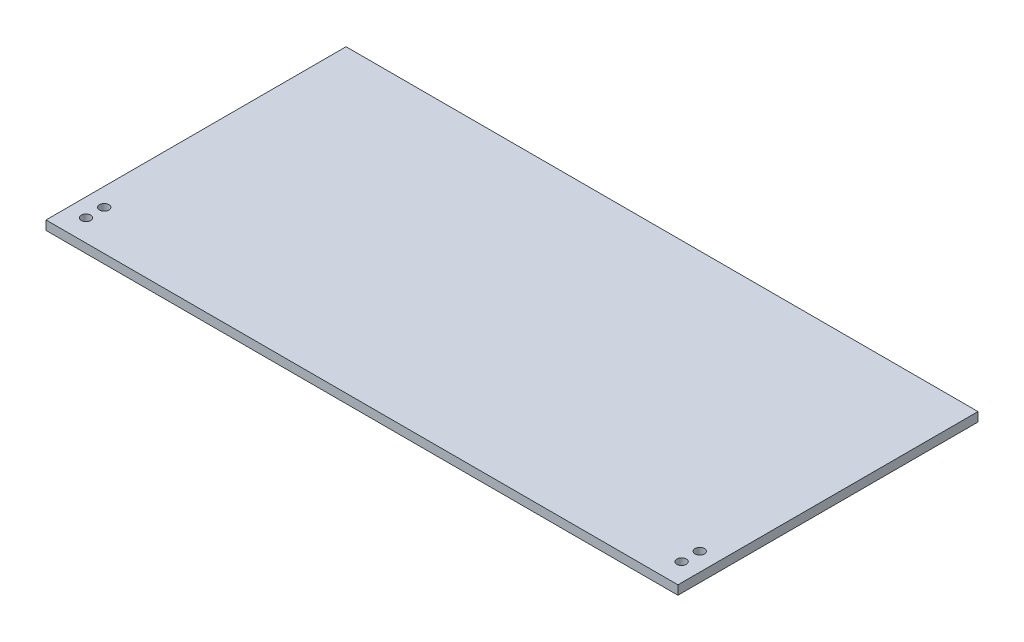
ISO-10303-21;
HEADER;
FILE_DESCRIPTION(('STEP AP214'),'2;1');
FILE_NAME('part.step','',(''),(''),'','','');
FILE_SCHEMA(('AUTOMOTIVE_DESIGN { 1 0 10303 214 1 1 1 1 }'));
ENDSEC;
DATA;
#1=APPLICATION_CONTEXT('core data for automotive mechanical design processes');
#2=APPLICATION_PROTOCOL_DEFINITION('international standard','automotive_design',2000,#1);
#3=PRODUCT_CONTEXT('',#1,'mechanical');
#4=PRODUCT('Part','Part','',(#3));
#5=PRODUCT_RELATED_PRODUCT_CATEGORY('part','',(#4));
#6=PRODUCT_DEFINITION_FORMATION('','',#4);
#7=PRODUCT_DEFINITION_CONTEXT('part definition',#1,'design');
#8=PRODUCT_DEFINITION('design','',#6,#7);
#9=PRODUCT_DEFINITION_SHAPE('','',#8);
#10=(LENGTH_UNIT() NAMED_UNIT(*) SI_UNIT(.MILLI.,.METRE.));
#11=(NAMED_UNIT(*) PLANE_ANGLE_UNIT() SI_UNIT($,.RADIAN.));
#12=(NAMED_UNIT(*) SI_UNIT($,.STERADIAN.) SOLID_ANGLE_UNIT());
#13=UNCERTAINTY_MEASURE_WITH_UNIT(LENGTH_MEASURE(1.E-05),#10,'distance_accuracy_value','');
#14=(GEOMETRIC_REPRESENTATION_CONTEXT(3) GLOBAL_UNCERTAINTY_ASSIGNED_CONTEXT((#13)) GLOBAL_UNIT_ASSIGNED_CONTEXT((#10,
#11,#12)) REPRESENTATION_CONTEXT('',''));
#15=CARTESIAN_POINT('',(0.,0.,0.));
#16=DIRECTION('',(0.,0.,1.));
#17=DIRECTION('',(1.,0.,0.));
#18=AXIS2_PLACEMENT_3D('',#15,#16,#17);
#19=CARTESIAN_POINT('',(-173.75,0.,82.5));
#20=DIRECTION('',(0.,0.,1.));
#21=DIRECTION('',(1.,0.,0.));
#22=AXIS2_PLACEMENT_3D('',#19,#20,#21);
#23=PLANE('',#22);
#24=DIRECTION('',(1.,0.,0.));
#25=VECTOR('',#24,1.);
#26=CARTESIAN_POINT('',(-173.75,5.,82.5));
#27=LINE('',#26,#25);
#28=CARTESIAN_POINT('',(-173.75,5.,82.5));
#29=VERTEX_POINT('',#28);
#30=CARTESIAN_POINT('',(173.75,5.,82.5));
#31=VERTEX_POINT('',#30);
#32=EDGE_CURVE('E99',#29,#31,#27,.T.);
#33=ORIENTED_EDGE('',*,*,#32,.F.);
#34=DIRECTION('',(0.,1.,0.));
#35=VECTOR('',#34,1.);
#36=CARTESIAN_POINT('',(-173.75,0.,82.5));
#37=LINE('',#36,#35);
#38=CARTESIAN_POINT('',(-173.75,0.,82.5));
#39=VERTEX_POINT('',#38);
#40=EDGE_CURVE('E11',#39,#29,#37,.T.);
#41=ORIENTED_EDGE('',*,*,#40,.F.);
#42=DIRECTION('',(1.,0.,0.));
#43=VECTOR('',#42,1.);
#44=CARTESIAN_POINT('',(-173.75,0.,82.5));
#45=LINE('',#44,#43);
#46=CARTESIAN_POINT('',(173.75,0.,82.5));
#47=VERTEX_POINT('',#46);
#48=EDGE_CURVE('E92',#39,#47,#45,.T.);
#49=ORIENTED_EDGE('',*,*,#48,.T.);
#50=DIRECTION('',(0.,1.,0.));
#51=VECTOR('',#50,1.);
#52=CARTESIAN_POINT('',(173.75,0.,82.5));
#53=LINE('',#52,#51);
#54=EDGE_CURVE('E37',#47,#31,#53,.T.);
#55=ORIENTED_EDGE('',*,*,#54,.T.);
#56=EDGE_LOOP('',(#33,#41,#49,#55));
#57=FACE_BOUND('',#56,.T.);
#58=ADVANCED_FACE('F34',(#57),#23,.T.);
#59=CARTESIAN_POINT('',(-173.75,0.,-82.5));
#60=DIRECTION('',(-1.,0.,0.));
#61=DIRECTION('',(0.,0.,1.));
#62=AXIS2_PLACEMENT_3D('',#59,#60,#61);
#63=PLANE('',#62);
#64=DIRECTION('',(0.,0.,1.));
#65=VECTOR('',#64,1.);
#66=CARTESIAN_POINT('',(-173.75,5.,-82.5));
#67=LINE('',#66,#65);
#68=CARTESIAN_POINT('',(-173.75,5.,-82.5));
#69=VERTEX_POINT('',#68);
#70=EDGE_CURVE('E94',#69,#29,#67,.T.);
#71=ORIENTED_EDGE('',*,*,#70,.F.);
#72=DIRECTION('',(0.,1.,0.));
#73=VECTOR('',#72,1.);
#74=CARTESIAN_POINT('',(-173.75,0.,-82.5));
#75=LINE('',#74,#73);
#76=CARTESIAN_POINT('',(-173.75,0.,-82.5));
#77=VERTEX_POINT('',#76);
#78=EDGE_CURVE('E43',#77,#69,#75,.T.);
#79=ORIENTED_EDGE('',*,*,#78,.F.);
#80=DIRECTION('',(0.,0.,1.));
#81=VECTOR('',#80,1.);
#82=CARTESIAN_POINT('',(-173.75,0.,-82.5));
#83=LINE('',#82,#81);
#84=EDGE_CURVE('E89',#77,#39,#83,.T.);
#85=ORIENTED_EDGE('',*,*,#84,.T.);
#86=ORIENTED_EDGE('',*,*,#40,.T.);
#87=EDGE_LOOP('',(#71,#79,#85,#86));
#88=FACE_BOUND('',#87,.T.);
#89=ADVANCED_FACE('F110',(#88),#63,.T.);
#90=CARTESIAN_POINT('',(173.75,0.,-82.5));
#91=DIRECTION('',(0.,0.,-1.));
#92=DIRECTION('',(-1.,0.,0.));
#93=AXIS2_PLACEMENT_3D('',#90,#91,#92);
#94=PLANE('',#93);
#95=DIRECTION('',(-1.,0.,0.));
#96=VECTOR('',#95,1.);
#97=CARTESIAN_POINT('',(173.75,5.,-82.5));
#98=LINE('',#97,#96);
#99=CARTESIAN_POINT('',(173.75,5.,-82.5));
#100=VERTEX_POINT('',#99);
#101=EDGE_CURVE('E84',#100,#69,#98,.T.);
#102=ORIENTED_EDGE('',*,*,#101,.F.);
#103=DIRECTION('',(0.,1.,0.));
#104=VECTOR('',#103,1.);
#105=CARTESIAN_POINT('',(173.75,0.,-82.5));
#106=LINE('',#105,#104);
#107=CARTESIAN_POINT('',(173.75,0.,-82.5));
#108=VERTEX_POINT('',#107);
#109=EDGE_CURVE('E79',#108,#100,#106,.T.);
#110=ORIENTED_EDGE('',*,*,#109,.F.);
#111=DIRECTION('',(-1.,0.,0.));
#112=VECTOR('',#111,1.);
#113=CARTESIAN_POINT('',(173.75,0.,-82.5));
#114=LINE('',#113,#112);
#115=EDGE_CURVE('E82',#108,#77,#114,.T.);
#116=ORIENTED_EDGE('',*,*,#115,.T.);
#117=ORIENTED_EDGE('',*,*,#78,.T.);
#118=EDGE_LOOP('',(#102,#110,#116,#117));
#119=FACE_BOUND('',#118,.T.);
#120=ADVANCED_FACE('F81',(#119),#94,.T.);
#121=CARTESIAN_POINT('',(173.75,0.,82.5));
#122=DIRECTION('',(1.,0.,0.));
#123=DIRECTION('',(0.,0.,-1.));
#124=AXIS2_PLACEMENT_3D('',#121,#122,#123);
#125=PLANE('',#124);
#126=DIRECTION('',(0.,0.,-1.));
#127=VECTOR('',#126,1.);
#128=CARTESIAN_POINT('',(173.75,5.,82.5));
#129=LINE('',#128,#127);
#130=EDGE_CURVE('E102',#31,#100,#129,.T.);
#131=ORIENTED_EDGE('',*,*,#130,.F.);
#132=ORIENTED_EDGE('',*,*,#54,.F.);
#133=DIRECTION('',(0.,0.,-1.));
#134=VECTOR('',#133,1.);
#135=CARTESIAN_POINT('',(173.75,0.,82.5));
#136=LINE('',#135,#134);
#137=EDGE_CURVE('E88',#47,#108,#136,.T.);
#138=ORIENTED_EDGE('',*,*,#137,.T.);
#139=ORIENTED_EDGE('',*,*,#109,.T.);
#140=EDGE_LOOP('',(#131,#132,#138,#139));
#141=FACE_BOUND('',#140,.T.);
#142=ADVANCED_FACE('F91',(#141),#125,.T.);
#143=CARTESIAN_POINT('',(0.,0.,0.));
#144=DIRECTION('',(0.,1.,0.));
#145=DIRECTION('',(0.,0.,1.));
#146=AXIS2_PLACEMENT_3D('',#143,#144,#145);
#147=PLANE('',#146);
#148=CARTESIAN_POINT('',(163.75,0.,70.5));
#149=DIRECTION('',(0.,1.,0.));
#150=DIRECTION('',(0.,0.,-1.));
#151=AXIS2_PLACEMENT_3D('',#148,#149,#150);
#152=CIRCLE('',#151,2.59999999999999);
#153=CARTESIAN_POINT('',(163.75,0.,67.9));
#154=VERTEX_POINT('',#153);
#155=EDGE_CURVE('E151',#154,#154,#152,.T.);
#156=ORIENTED_EDGE('',*,*,#155,.T.);
#157=EDGE_LOOP('',(#156));
#158=FACE_BOUND('',#157,.T.);
#159=CARTESIAN_POINT('',(163.75,0.,60.5));
#160=DIRECTION('',(0.,1.,0.));
#161=DIRECTION('',(0.,0.,-1.));
#162=AXIS2_PLACEMENT_3D('',#159,#160,#161);
#163=CIRCLE('',#162,2.59999999999998);
#164=CARTESIAN_POINT('',(163.75,0.,57.9));
#165=VERTEX_POINT('',#164);
#166=EDGE_CURVE('E159',#165,#165,#163,.T.);
#167=ORIENTED_EDGE('',*,*,#166,.T.);
#168=EDGE_LOOP('',(#167));
#169=FACE_BOUND('',#168,.T.);
#170=CARTESIAN_POINT('',(-163.75,0.,60.5));
#171=DIRECTION('',(0.,1.,0.));
#172=DIRECTION('',(0.,0.,-1.));
#173=AXIS2_PLACEMENT_3D('',#170,#171,#172);
#174=CIRCLE('',#173,2.59999999999999);
#175=CARTESIAN_POINT('',(-163.75,0.,57.9000000000001));
#176=VERTEX_POINT('',#175);
#177=EDGE_CURVE('E165',#176,#176,#174,.T.);
#178=ORIENTED_EDGE('',*,*,#177,.T.);
#179=EDGE_LOOP('',(#178));
#180=FACE_BOUND('',#179,.T.);
#181=CARTESIAN_POINT('',(-163.75,0.,70.5));
#182=DIRECTION('',(0.,1.,0.));
#183=DIRECTION('',(0.,0.,-1.));
#184=AXIS2_PLACEMENT_3D('',#181,#182,#183);
#185=CIRCLE('',#184,2.59999999999999);
#186=CARTESIAN_POINT('',(-163.75,0.,67.9000000000001));
#187=VERTEX_POINT('',#186);
#188=EDGE_CURVE('E103',#187,#187,#185,.T.);
#189=ORIENTED_EDGE('',*,*,#188,.T.);
#190=EDGE_LOOP('',(#189));
#191=FACE_BOUND('',#190,.T.);
#192=ORIENTED_EDGE('',*,*,#48,.F.);
#193=ORIENTED_EDGE('',*,*,#84,.F.);
#194=ORIENTED_EDGE('',*,*,#115,.F.);
#195=ORIENTED_EDGE('',*,*,#137,.F.);
#196=EDGE_LOOP('',(#192,#193,#194,#195));
#197=FACE_BOUND('',#196,.T.);
#198=ADVANCED_FACE('F87',(#158,#169,#180,#191,#197),#147,.F.);
#199=CARTESIAN_POINT('',(0.,5.,0.));
#200=DIRECTION('',(0.,1.,0.));
#201=DIRECTION('',(0.,0.,1.));
#202=AXIS2_PLACEMENT_3D('',#199,#200,#201);
#203=PLANE('',#202);
#204=CARTESIAN_POINT('',(163.75,5.,70.5));
#205=DIRECTION('',(0.,1.,0.));
#206=DIRECTION('',(0.,0.,-1.));
#207=AXIS2_PLACEMENT_3D('',#204,#205,#206);
#208=CIRCLE('',#207,2.59999999999999);
#209=CARTESIAN_POINT('',(163.75,5.,67.9));
#210=VERTEX_POINT('',#209);
#211=EDGE_CURVE('E154',#210,#210,#208,.T.);
#212=ORIENTED_EDGE('',*,*,#211,.F.);
#213=EDGE_LOOP('',(#212));
#214=FACE_BOUND('',#213,.T.);
#215=CARTESIAN_POINT('',(163.75,5.,60.5));
#216=DIRECTION('',(0.,1.,0.));
#217=DIRECTION('',(0.,0.,-1.));
#218=AXIS2_PLACEMENT_3D('',#215,#216,#217);
#219=CIRCLE('',#218,2.59999999999998);
#220=CARTESIAN_POINT('',(163.75,5.,57.9));
#221=VERTEX_POINT('',#220);
#222=EDGE_CURVE('E156',#221,#221,#219,.T.);
#223=ORIENTED_EDGE('',*,*,#222,.F.);
#224=EDGE_LOOP('',(#223));
#225=FACE_BOUND('',#224,.T.);
#226=CARTESIAN_POINT('',(-163.75,5.,60.5));
#227=DIRECTION('',(0.,1.,0.));
#228=DIRECTION('',(0.,0.,-1.));
#229=AXIS2_PLACEMENT_3D('',#226,#227,#228);
#230=CIRCLE('',#229,2.59999999999999);
#231=CARTESIAN_POINT('',(-163.75,5.,57.9000000000001));
#232=VERTEX_POINT('',#231);
#233=EDGE_CURVE('E162',#232,#232,#230,.T.);
#234=ORIENTED_EDGE('',*,*,#233,.F.);
#235=EDGE_LOOP('',(#234));
#236=FACE_BOUND('',#235,.T.);
#237=CARTESIAN_POINT('',(-163.75,5.,70.5));
#238=DIRECTION('',(0.,1.,0.));
#239=DIRECTION('',(0.,0.,-1.));
#240=AXIS2_PLACEMENT_3D('',#237,#238,#239);
#241=CIRCLE('',#240,2.59999999999999);
#242=CARTESIAN_POINT('',(-163.75,5.,67.9000000000001));
#243=VERTEX_POINT('',#242);
#244=EDGE_CURVE('E168',#243,#243,#241,.T.);
#245=ORIENTED_EDGE('',*,*,#244,.F.);
#246=EDGE_LOOP('',(#245));
#247=FACE_BOUND('',#246,.T.);
#248=ORIENTED_EDGE('',*,*,#32,.T.);
#249=ORIENTED_EDGE('',*,*,#130,.T.);
#250=ORIENTED_EDGE('',*,*,#101,.T.);
#251=ORIENTED_EDGE('',*,*,#70,.T.);
#252=EDGE_LOOP('',(#248,#249,#250,#251));
#253=FACE_BOUND('',#252,.T.);
#254=ADVANCED_FACE('F109',(#214,#225,#236,#247,#253),#203,.T.);
#255=CARTESIAN_POINT('',(-163.75,0.,70.5));
#256=DIRECTION('',(0.,1.,0.));
#257=DIRECTION('',(0.,0.,1.));
#258=AXIS2_PLACEMENT_3D('',#255,#256,#257);
#259=CYLINDRICAL_SURFACE('',#258,2.59999999999999);
#260=ORIENTED_EDGE('',*,*,#188,.F.);
#261=EDGE_LOOP('',(#260));
#262=FACE_BOUND('',#261,.T.);
#263=ORIENTED_EDGE('',*,*,#244,.T.);
#264=EDGE_LOOP('',(#263));
#265=FACE_BOUND('',#264,.T.);
#266=ADVANCED_FACE('F128',(#262,#265),#259,.F.);
#267=CARTESIAN_POINT('',(-163.75,0.,60.5));
#268=DIRECTION('',(0.,1.,0.));
#269=DIRECTION('',(0.,0.,1.));
#270=AXIS2_PLACEMENT_3D('',#267,#268,#269);
#271=CYLINDRICAL_SURFACE('',#270,2.59999999999999);
#272=ORIENTED_EDGE('',*,*,#177,.F.);
#273=EDGE_LOOP('',(#272));
#274=FACE_BOUND('',#273,.T.);
#275=ORIENTED_EDGE('',*,*,#233,.T.);
#276=EDGE_LOOP('',(#275));
#277=FACE_BOUND('',#276,.T.);
#278=ADVANCED_FACE('F135',(#274,#277),#271,.F.);
#279=CARTESIAN_POINT('',(163.75,0.,60.5));
#280=DIRECTION('',(0.,1.,0.));
#281=DIRECTION('',(0.,0.,1.));
#282=AXIS2_PLACEMENT_3D('',#279,#280,#281);
#283=CYLINDRICAL_SURFACE('',#282,2.59999999999998);
#284=ORIENTED_EDGE('',*,*,#166,.F.);
#285=EDGE_LOOP('',(#284));
#286=FACE_BOUND('',#285,.T.);
#287=ORIENTED_EDGE('',*,*,#222,.T.);
#288=EDGE_LOOP('',(#287));
#289=FACE_BOUND('',#288,.T.);
#290=ADVANCED_FACE('F139',(#286,#289),#283,.F.);
#291=CARTESIAN_POINT('',(163.75,0.,70.5));
#292=DIRECTION('',(0.,1.,0.));
#293=DIRECTION('',(0.,0.,1.));
#294=AXIS2_PLACEMENT_3D('',#291,#292,#293);
#295=CYLINDRICAL_SURFACE('',#294,2.59999999999999);
#296=ORIENTED_EDGE('',*,*,#155,.F.);
#297=EDGE_LOOP('',(#296));
#298=FACE_BOUND('',#297,.T.);
#299=ORIENTED_EDGE('',*,*,#211,.T.);
#300=EDGE_LOOP('',(#299));
#301=FACE_BOUND('',#300,.T.);
#302=ADVANCED_FACE('F143',(#298,#301),#295,.F.);
#303=CLOSED_SHELL('',(#58,#89,#120,#142,#198,#254,#266,#278,#290,#302));
#304=MANIFOLD_SOLID_BREP('B2',#303);
#305=ADVANCED_BREP_SHAPE_REPRESENTATION('',(#18,#304),#14);
#306=SHAPE_DEFINITION_REPRESENTATION(#9,#305);
ENDSEC;
END-ISO-10303-21;
